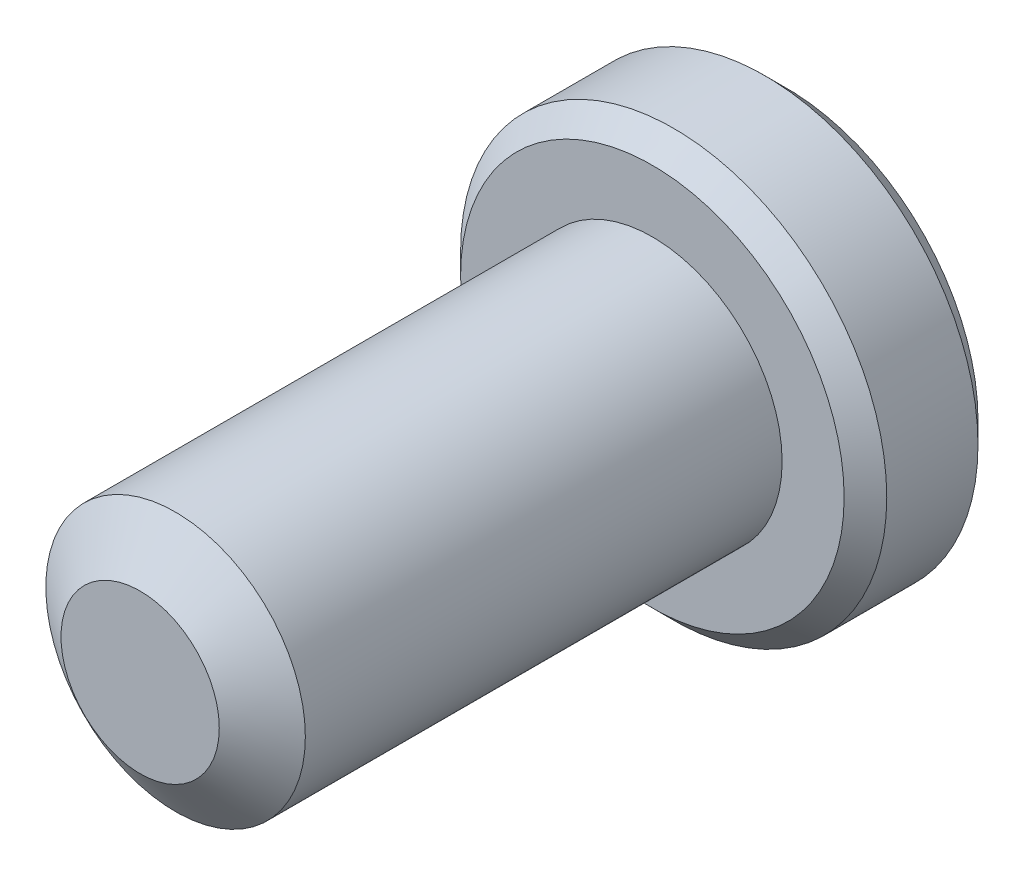
ISO-10303-21;
HEADER;
FILE_DESCRIPTION(('STEP AP214'),'2;1');
FILE_NAME('part.step','',(''),(''),'','','');
FILE_SCHEMA(('AUTOMOTIVE_DESIGN { 1 0 10303 214 1 1 1 1 }'));
ENDSEC;
DATA;
#1=APPLICATION_CONTEXT('core data for automotive mechanical design processes');
#2=APPLICATION_PROTOCOL_DEFINITION('international standard','automotive_design',2000,#1);
#3=PRODUCT_CONTEXT('',#1,'mechanical');
#4=PRODUCT('Part','Part','',(#3));
#5=PRODUCT_RELATED_PRODUCT_CATEGORY('part','',(#4));
#6=PRODUCT_DEFINITION_FORMATION('','',#4);
#7=PRODUCT_DEFINITION_CONTEXT('part definition',#1,'design');
#8=PRODUCT_DEFINITION('design','',#6,#7);
#9=PRODUCT_DEFINITION_SHAPE('','',#8);
#10=(LENGTH_UNIT() NAMED_UNIT(*) SI_UNIT(.MILLI.,.METRE.));
#11=(NAMED_UNIT(*) PLANE_ANGLE_UNIT() SI_UNIT($,.RADIAN.));
#12=(NAMED_UNIT(*) SI_UNIT($,.STERADIAN.) SOLID_ANGLE_UNIT());
#13=UNCERTAINTY_MEASURE_WITH_UNIT(LENGTH_MEASURE(1.E-05),#10,'distance_accuracy_value','');
#14=(GEOMETRIC_REPRESENTATION_CONTEXT(3) GLOBAL_UNCERTAINTY_ASSIGNED_CONTEXT((#13)) GLOBAL_UNIT_ASSIGNED_CONTEXT((#10,
#11,#12)) REPRESENTATION_CONTEXT('',''));
#15=CARTESIAN_POINT('',(0.,0.,0.));
#16=DIRECTION('',(0.,0.,1.));
#17=DIRECTION('',(1.,0.,0.));
#18=AXIS2_PLACEMENT_3D('',#15,#16,#17);
#19=CARTESIAN_POINT('',(0.,0.,-9.525));
#20=DIRECTION('',(0.,0.,1.));
#21=DIRECTION('',(1.,0.,0.));
#22=AXIS2_PLACEMENT_3D('',#19,#20,#21);
#23=CYLINDRICAL_SURFACE('',#22,2.413);
#24=CARTESIAN_POINT('',(0.,0.,-9.525));
#25=DIRECTION('',(0.,0.,-1.));
#26=DIRECTION('',(-1.,0.,0.));
#27=AXIS2_PLACEMENT_3D('',#24,#25,#26);
#28=CIRCLE('',#27,2.413);
#29=CARTESIAN_POINT('',(2.413,0.,-9.525));
#30=VERTEX_POINT('',#29);
#31=EDGE_CURVE('E219',#30,#30,#28,.F.);
#32=CARTESIAN_POINT('',(0.,0.,-0.659180743038973));
#33=DIRECTION('',(0.,0.,1.));
#34=DIRECTION('',(1.,0.,0.));
#35=AXIS2_PLACEMENT_3D('',#32,#33,#34);
#36=CIRCLE('',#35,2.413);
#37=CARTESIAN_POINT('',(2.413,0.,-0.659180743038973));
#38=VERTEX_POINT('',#37);
#39=EDGE_CURVE('E113',#38,#38,#36,.T.);
#40=CARTESIAN_POINT('',(2.413,0.,-9.525));
#41=CARTESIAN_POINT('',(2.413,0.,-9.43264771607332));
#42=CARTESIAN_POINT('',(2.413,0.,-9.34029543214664));
#43=CARTESIAN_POINT('',(2.413,0.,-9.15559086429329));
#44=CARTESIAN_POINT('',(2.413,0.,-9.06323858036661));
#45=CARTESIAN_POINT('',(2.413,0.,-8.87853401251326));
#46=CARTESIAN_POINT('',(2.413,0.,-8.78618172858658));
#47=CARTESIAN_POINT('',(2.413,0.,-8.60147716073322));
#48=CARTESIAN_POINT('',(2.413,0.,-8.50912487680655));
#49=CARTESIAN_POINT('',(2.413,0.,-8.32442030895319));
#50=CARTESIAN_POINT('',(2.413,0.,-8.23206802502652));
#51=CARTESIAN_POINT('',(2.413,0.,-8.04736345717316));
#52=CARTESIAN_POINT('',(2.413,0.,-7.95501117324648));
#53=CARTESIAN_POINT('',(2.413,0.,-7.77030660539313));
#54=CARTESIAN_POINT('',(2.413,0.,-7.67795432146645));
#55=CARTESIAN_POINT('',(2.413,0.,-7.4932497536131));
#56=CARTESIAN_POINT('',(2.413,0.,-7.40089746968642));
#57=CARTESIAN_POINT('',(2.413,0.,-7.21619290183307));
#58=CARTESIAN_POINT('',(2.413,0.,-7.12384061790639));
#59=CARTESIAN_POINT('',(2.413,0.,-6.93913605005303));
#60=CARTESIAN_POINT('',(2.413,0.,-6.84678376612636));
#61=CARTESIAN_POINT('',(2.413,0.,-6.662079198273));
#62=CARTESIAN_POINT('',(2.413,0.,-6.56972691434632));
#63=CARTESIAN_POINT('',(2.413,0.,-6.38502234649297));
#64=CARTESIAN_POINT('',(2.413,0.,-6.29267006256629));
#65=CARTESIAN_POINT('',(2.413,0.,-6.10796549471294));
#66=CARTESIAN_POINT('',(2.413,0.,-6.01561321078626));
#67=CARTESIAN_POINT('',(2.413,0.,-5.83090864293291));
#68=CARTESIAN_POINT('',(2.413,0.,-5.73855635900623));
#69=CARTESIAN_POINT('',(2.413,0.,-5.55385179115287));
#70=CARTESIAN_POINT('',(2.413,0.,-5.4614995072262));
#71=CARTESIAN_POINT('',(2.413,0.,-5.27679493937284));
#72=CARTESIAN_POINT('',(2.413,0.,-5.18444265544616));
#73=CARTESIAN_POINT('',(2.413,0.,-4.99973808759281));
#74=CARTESIAN_POINT('',(2.413,0.,-4.90738580366613));
#75=CARTESIAN_POINT('',(2.413,0.,-4.72268123581278));
#76=CARTESIAN_POINT('',(2.413,0.,-4.6303289518861));
#77=CARTESIAN_POINT('',(2.413,0.,-4.44562438403275));
#78=CARTESIAN_POINT('',(2.413,0.,-4.35327210010607));
#79=CARTESIAN_POINT('',(2.413,0.,-4.16856753225271));
#80=CARTESIAN_POINT('',(2.413,0.,-4.07621524832604));
#81=CARTESIAN_POINT('',(2.413,0.,-3.89151068047268));
#82=CARTESIAN_POINT('',(2.413,0.,-3.799158396546));
#83=CARTESIAN_POINT('',(2.413,0.,-3.61445382869265));
#84=CARTESIAN_POINT('',(2.413,0.,-3.52210154476597));
#85=CARTESIAN_POINT('',(2.413,0.,-3.33739697691262));
#86=CARTESIAN_POINT('',(2.413,0.,-3.24504469298594));
#87=CARTESIAN_POINT('',(2.413,0.,-3.06034012513258));
#88=CARTESIAN_POINT('',(2.413,0.,-2.96798784120591));
#89=CARTESIAN_POINT('',(2.413,0.,-2.78328327335255));
#90=CARTESIAN_POINT('',(2.413,0.,-2.69093098942588));
#91=CARTESIAN_POINT('',(2.413,0.,-2.50622642157252));
#92=CARTESIAN_POINT('',(2.413,0.,-2.41387413764584));
#93=CARTESIAN_POINT('',(2.413,0.,-2.22916956979249));
#94=CARTESIAN_POINT('',(2.413,0.,-2.13681728586581));
#95=CARTESIAN_POINT('',(2.413,0.,-1.95211271801246));
#96=CARTESIAN_POINT('',(2.413,0.,-1.85976043408578));
#97=CARTESIAN_POINT('',(2.413,0.,-1.67505586623242));
#98=CARTESIAN_POINT('',(2.413,0.,-1.58270358230575));
#99=CARTESIAN_POINT('',(2.413,0.,-1.39799901445239));
#100=CARTESIAN_POINT('',(2.413,0.,-1.30564673052571));
#101=CARTESIAN_POINT('',(2.413,0.,-1.12094216267236));
#102=CARTESIAN_POINT('',(2.413,0.,-1.02858987874568));
#103=CARTESIAN_POINT('',(2.413,0.,-0.843885310892327));
#104=CARTESIAN_POINT('',(2.413,0.,-0.75153302696565));
#105=CARTESIAN_POINT('',(2.413,0.,-0.659180743038973));
#106=B_SPLINE_CURVE_WITH_KNOTS('',3,(#40,#41,#42,#43,#44,#45,#46,#47,#48,#49,#50,#51,#52,#53,
#54,#55,#56,#57,#58,#59,#60,#61,#62,#63,#64,#65,#66,#67,#68,#69,#70,#71,#72,#73,#74,#75,#76,#77,
#78,#79,#80,#81,#82,#83,#84,#85,#86,#87,#88,#89,#90,#91,#92,#93,#94,#95,#96,#97,#98,#99,#100,
#101,#102,#103,#104,#105),.UNSPECIFIED.,.F.,.F.,(4,2,2,2,2,2,2,2,2,2,2,2,2,2,2,2,2,2,2,2,2,2,2,
2,2,2,2,2,2,2,2,2,4),(0.,0.277056851780031,0.554113703560063,0.831170555340096,1.10822740712013,
1.38528425890016,1.66234111068019,1.93939796246022,2.21645481424026,2.49351166602029,
2.77056851780032,3.04762536958035,3.32468222136038,3.60173907314042,3.87879592492045,
4.15585277670048,4.43290962848051,4.70996648026054,4.98702333204058,5.26408018382061,
5.54113703560064,5.81819388738067,6.09525073916071,6.37230759094074,6.64936444272077,
6.9264212945008,7.20347814628083,7.48053499806087,7.7575918498409,8.03464870162093,
8.31170555340096,8.58876240518099,8.86581925696103),.UNSPECIFIED.);
#107=EDGE_CURVE('BSEAM39',#30,#38,#106,.T.);
#108=ORIENTED_EDGE('',*,*,#31,.T.);
#109=ORIENTED_EDGE('',*,*,#39,.F.);
#110=ORIENTED_EDGE('',*,*,#107,.T.);
#111=ORIENTED_EDGE('',*,*,#107,.F.);
#112=EDGE_LOOP('',(#108,#110,#109,#111));
#113=FACE_BOUND('',#112,.T.);
#114=ADVANCED_FACE('F39',(#113),#23,.T.);
#115=CARTESIAN_POINT('',(0.,0.,0.));
#116=DIRECTION('',(0.,0.,-1.));
#117=DIRECTION('',(-1.,0.,0.));
#118=AXIS2_PLACEMENT_3D('',#115,#116,#117);
#119=CONICAL_SURFACE('',#118,1.4715923357461,0.959931088596884);
#120=ORIENTED_EDGE('',*,*,#39,.T.);
#121=EDGE_LOOP('',(#120));
#122=FACE_BOUND('',#121,.T.);
#123=CARTESIAN_POINT('',(0.,0.,0.));
#124=DIRECTION('',(0.,0.,1.));
#125=DIRECTION('',(1.,0.,0.));
#126=AXIS2_PLACEMENT_3D('',#123,#124,#125);
#127=CIRCLE('',#126,1.4715923357461);
#128=CARTESIAN_POINT('',(1.4715923357461,0.,0.));
#129=VERTEX_POINT('',#128);
#130=EDGE_CURVE('E217',#129,#129,#127,.T.);
#131=ORIENTED_EDGE('',*,*,#130,.F.);
#132=EDGE_LOOP('',(#131));
#133=FACE_BOUND('',#132,.T.);
#134=ADVANCED_FACE('F200',(#122,#133),#119,.T.);
#135=CARTESIAN_POINT('',(0.,0.,0.));
#136=DIRECTION('',(0.,0.,1.));
#137=DIRECTION('',(1.,0.,0.));
#138=AXIS2_PLACEMENT_3D('',#135,#136,#137);
#139=PLANE('',#138);
#140=ORIENTED_EDGE('',*,*,#130,.T.);
#141=EDGE_LOOP('',(#140));
#142=FACE_BOUND('',#141,.T.);
#143=ADVANCED_FACE('F197',(#142),#139,.T.);
#144=CARTESIAN_POINT('',(0.,0.,-12.0142));
#145=DIRECTION('',(0.,0.,1.));
#146=DIRECTION('',(1.,0.,0.));
#147=AXIS2_PLACEMENT_3D('',#144,#145,#146);
#148=CYLINDRICAL_SURFACE('',#147,3.9624);
#149=CARTESIAN_POINT('',(0.,0.,-11.61796));
#150=DIRECTION('',(0.,0.,-1.));
#151=DIRECTION('',(-1.,0.,0.));
#152=AXIS2_PLACEMENT_3D('',#149,#150,#151);
#153=CIRCLE('',#152,3.9624);
#154=CARTESIAN_POINT('',(3.9624,0.,-11.61796));
#155=VERTEX_POINT('',#154);
#156=EDGE_CURVE('E47',#155,#155,#153,.F.);
#157=ORIENTED_EDGE('',*,*,#156,.T.);
#158=EDGE_LOOP('',(#157));
#159=FACE_BOUND('',#158,.T.);
#160=CARTESIAN_POINT('',(0.,0.,-9.92124));
#161=DIRECTION('',(0.,0.,-1.));
#162=DIRECTION('',(-1.,0.,0.));
#163=AXIS2_PLACEMENT_3D('',#160,#161,#162);
#164=CIRCLE('',#163,3.9624);
#165=CARTESIAN_POINT('',(-3.9624,0.,-9.92124));
#166=VERTEX_POINT('',#165);
#167=EDGE_CURVE('E176',#166,#166,#164,.T.);
#168=ORIENTED_EDGE('',*,*,#167,.T.);
#169=EDGE_LOOP('',(#168));
#170=FACE_BOUND('',#169,.T.);
#171=ADVANCED_FACE('F181',(#159,#170),#148,.T.);
#172=CARTESIAN_POINT('',(0.,0.,-12.0142));
#173=DIRECTION('',(0.,0.,-1.));
#174=DIRECTION('',(-1.,0.,0.));
#175=AXIS2_PLACEMENT_3D('',#172,#173,#174);
#176=PLANE('',#175);
#177=CARTESIAN_POINT('',(0.,0.,-12.0142));
#178=DIRECTION('',(0.,0.,-1.));
#179=DIRECTION('',(-1.,0.,0.));
#180=AXIS2_PLACEMENT_3D('',#177,#178,#179);
#181=CIRCLE('',#180,3.56616);
#182=CARTESIAN_POINT('',(3.56616,0.,-12.0142));
#183=VERTEX_POINT('',#182);
#184=EDGE_CURVE('E112',#183,#183,#181,.T.);
#185=ORIENTED_EDGE('',*,*,#184,.T.);
#186=EDGE_LOOP('',(#185));
#187=FACE_BOUND('',#186,.T.);
#188=CARTESIAN_POINT('',(0.,0.,-12.0142));
#189=DIRECTION('',(0.,0.,-1.));
#190=DIRECTION('',(-1.,0.,0.));
#191=AXIS2_PLACEMENT_3D('',#188,#189,#190);
#192=CIRCLE('',#191,1.3748153285078);
#193=CARTESIAN_POINT('',(-1.190625,0.687407664253897,-12.0142));
#194=VERTEX_POINT('',#193);
#195=CARTESIAN_POINT('',(0.,1.3748153285078,-12.0142));
#196=VERTEX_POINT('',#195);
#197=EDGE_CURVE('E93',#194,#196,#192,.T.);
#198=ORIENTED_EDGE('',*,*,#197,.F.);
#199=CARTESIAN_POINT('',(-1.190625,-0.687407664253898,-12.0142));
#200=VERTEX_POINT('',#199);
#201=EDGE_CURVE('E53',#200,#194,#192,.T.);
#202=ORIENTED_EDGE('',*,*,#201,.F.);
#203=CARTESIAN_POINT('',(0.,-1.3748153285078,-12.0142));
#204=VERTEX_POINT('',#203);
#205=EDGE_CURVE('E278',#204,#200,#192,.T.);
#206=ORIENTED_EDGE('',*,*,#205,.F.);
#207=CARTESIAN_POINT('',(1.190625,-0.687407664253898,-12.0142));
#208=VERTEX_POINT('',#207);
#209=EDGE_CURVE('E60',#208,#204,#192,.T.);
#210=ORIENTED_EDGE('',*,*,#209,.F.);
#211=CARTESIAN_POINT('',(1.190625,0.687407664253899,-12.0142));
#212=VERTEX_POINT('',#211);
#213=EDGE_CURVE('E134',#212,#208,#192,.T.);
#214=ORIENTED_EDGE('',*,*,#213,.F.);
#215=EDGE_CURVE('E102',#196,#212,#192,.T.);
#216=ORIENTED_EDGE('',*,*,#215,.F.);
#217=EDGE_LOOP('',(#198,#202,#206,#210,#214,#216));
#218=FACE_BOUND('',#217,.T.);
#219=ADVANCED_FACE('F133',(#187,#218),#176,.T.);
#220=CARTESIAN_POINT('',(0.,0.,-9.525));
#221=DIRECTION('',(0.,0.,-1.));
#222=DIRECTION('',(-1.,0.,0.));
#223=AXIS2_PLACEMENT_3D('',#220,#221,#222);
#224=PLANE('',#223);
#225=CARTESIAN_POINT('',(0.,0.,-9.525));
#226=DIRECTION('',(0.,0.,-1.));
#227=DIRECTION('',(-1.,0.,0.));
#228=AXIS2_PLACEMENT_3D('',#225,#226,#227);
#229=CIRCLE('',#228,3.56616);
#230=CARTESIAN_POINT('',(-3.56616,0.,-9.525));
#231=VERTEX_POINT('',#230);
#232=EDGE_CURVE('E11',#231,#231,#229,.F.);
#233=ORIENTED_EDGE('',*,*,#232,.T.);
#234=EDGE_LOOP('',(#233));
#235=FACE_BOUND('',#234,.T.);
#236=ORIENTED_EDGE('',*,*,#31,.F.);
#237=EDGE_LOOP('',(#236));
#238=FACE_BOUND('',#237,.T.);
#239=ADVANCED_FACE('F190',(#235,#238),#224,.F.);
#240=CARTESIAN_POINT('',(0.,0.,-12.0142));
#241=DIRECTION('',(0.,0.,-1.));
#242=DIRECTION('',(-1.,0.,0.));
#243=AXIS2_PLACEMENT_3D('',#240,#241,#242);
#244=CONICAL_SURFACE('',#243,1.3748153285078,0.78539816339745);
#245=ORIENTED_EDGE('',*,*,#215,.T.);
#246=CARTESIAN_POINT('',(-0.000200000000000167,1.37493079856163,-12.0143154846));
#247=CARTESIAN_POINT('',(0.0407344195898563,1.35129730039231,-11.9906987642143));
#248=CARTESIAN_POINT('',(0.0823533883019738,1.32726857760297,-11.9684687817231));
#249=CARTESIAN_POINT('',(0.167219443673632,1.27827113768909,-11.9277656626274));
#250=CARTESIAN_POINT('',(0.21047460729096,1.25329775733078,-11.9093151826476));
#251=CARTESIAN_POINT('',(0.297696647457423,1.2029400889614,-11.8777088380043));
#252=CARTESIAN_POINT('',(0.341641294957924,1.17756863489755,-11.8644735042433));
#253=CARTESIAN_POINT('',(0.430498374163692,1.12626697629869,-11.8440814515754));
#254=CARTESIAN_POINT('',(0.475408088834753,1.10033834044413,-11.836909502896));
#255=CARTESIAN_POINT('',(0.552804127656977,1.0556537165959,-11.8304385386489));
#256=CARTESIAN_POINT('',(0.585190412515645,1.0369554863147,-11.8294803201468));
#257=CARTESIAN_POINT('',(0.649906073317768,0.99959188212981,-11.8310926490721));
#258=CARTESIAN_POINT('',(0.682235435127271,0.980926516386365,-11.8336639751796));
#259=CARTESIAN_POINT('',(0.746582156071483,0.943775919727754,-11.8421867539936));
#260=CARTESIAN_POINT('',(0.778599196336766,0.925290872911938,-11.8481413547526));
#261=CARTESIAN_POINT('',(0.842098763396456,0.888629380776602,-11.8631099640712));
#262=CARTESIAN_POINT('',(0.873581054644163,0.870453071450032,-11.8721252859121));
#263=CARTESIAN_POINT('',(0.954214838572126,0.823899134593445,-11.898882295838));
#264=CARTESIAN_POINT('',(1.00285783526766,0.795815087357089,-11.918636814436));
#265=CARTESIAN_POINT('',(1.09823941635212,0.740746505842243,-11.9631367689577));
#266=CARTESIAN_POINT('',(1.14498361758716,0.713758728676141,-11.9878659647162));
#267=CARTESIAN_POINT('',(1.190825,0.68729219420006,-12.0143154846));
#268=B_SPLINE_CURVE_WITH_KNOTS('',3,(#246,#247,#248,#249,#250,#251,#252,#253,#254,#255,#256,
#257,#258,#259,#260,#261,#262,#263,#264,#265,#266,#267),.UNSPECIFIED.,.F.,.F.,(4,2,2,2,2,2,2,2,
2,2,4),(0.,0.158625672934121,0.31817607984327,0.475191357500654,0.631811068630747,
0.743878551794717,0.855970763007027,0.96816744442324,1.08041232768376,1.25873351645467,
1.43648174479847),.UNSPECIFIED.);
#269=EDGE_CURVE('E107',#196,#212,#268,.T.);
#270=ORIENTED_EDGE('',*,*,#269,.F.);
#271=EDGE_LOOP('',(#245,#270));
#272=FACE_BOUND('',#271,.T.);
#273=ADVANCED_FACE('F108',(#272),#244,.F.);
#274=ORIENTED_EDGE('',*,*,#213,.T.);
#275=CARTESIAN_POINT('',(1.190625,-1.37097145294693,-12.4551904472899));
#276=CARTESIAN_POINT('',(1.190625,-1.3375892063789,-12.4299899888078));
#277=CARTESIAN_POINT('',(1.190625,-1.30402095496658,-12.4050366202375));
#278=CARTESIAN_POINT('',(1.190625,-1.23643692297761,-12.3557260871772));
#279=CARTESIAN_POINT('',(1.190625,-1.20242103219112,-12.3313690738994));
#280=CARTESIAN_POINT('',(1.190625,-1.09909081482554,-12.2589982089892));
#281=CARTESIAN_POINT('',(1.190625,-1.02900143506767,-12.2120726225956));
#282=CARTESIAN_POINT('',(1.190625,-0.882026737424229,-12.1199521033256));
#283=CARTESIAN_POINT('',(1.190625,-0.804981866019981,-12.0750088372421));
#284=CARTESIAN_POINT('',(1.190625,-0.647043893307964,-11.9927980245069));
#285=CARTESIAN_POINT('',(1.190625,-0.56616494370292,-11.9555046017321));
#286=CARTESIAN_POINT('',(1.190625,-0.444764933868856,-11.9098795555631));
#287=CARTESIAN_POINT('',(1.190625,-0.406041211486713,-11.8967848390215));
#288=CARTESIAN_POINT('',(1.190625,-0.327658904711933,-11.8737042758966));
#289=CARTESIAN_POINT('',(1.190625,-0.288000256118252,-11.863718643486));
#290=CARTESIAN_POINT('',(1.190625,-0.208647693212097,-11.8475412290653));
#291=CARTESIAN_POINT('',(1.190625,-0.168967240621962,-11.841284445849));
#292=CARTESIAN_POINT('',(1.190625,-0.0891819742965335,-11.8326868884185));
#293=CARTESIAN_POINT('',(1.190625,-0.0490772347013127,-11.8303454410499));
#294=CARTESIAN_POINT('',(1.190625,0.0297075773931762,-11.8297522440677));
#295=CARTESIAN_POINT('',(1.190625,0.0683866068288083,-11.8313553537961));
#296=CARTESIAN_POINT('',(1.190625,0.14541687663315,-11.8382430277445));
#297=CARTESIAN_POINT('',(1.190625,0.183768052740678,-11.8435282976685));
#298=CARTESIAN_POINT('',(1.190625,0.260508634904943,-11.8575814122329));
#299=CARTESIAN_POINT('',(1.190625,0.298887052039132,-11.8664083626058));
#300=CARTESIAN_POINT('',(1.190625,0.374805334250663,-11.8870757099806));
#301=CARTESIAN_POINT('',(1.190625,0.412345269207093,-11.8989158548359));
#302=CARTESIAN_POINT('',(1.190625,0.530535580908838,-11.9406473336672));
#303=CARTESIAN_POINT('',(1.190625,0.609503725744446,-11.9752913969143));
#304=CARTESIAN_POINT('',(1.190625,0.763730269113465,-12.0523182519749));
#305=CARTESIAN_POINT('',(1.190625,0.838974064674605,-12.0947288466687));
#306=CARTESIAN_POINT('',(1.190625,0.982775796189617,-12.182225645025));
#307=CARTESIAN_POINT('',(1.190625,1.05148016607044,-12.2270741620552));
#308=CARTESIAN_POINT('',(1.190625,1.15270222256253,-12.2964053299226));
#309=CARTESIAN_POINT('',(1.190625,1.18600604145834,-12.3197601763372));
#310=CARTESIAN_POINT('',(1.190625,1.25215860362231,-12.3670875690193));
#311=CARTESIAN_POINT('',(1.190625,1.28500746868278,-12.3910599448583));
#312=CARTESIAN_POINT('',(1.190625,1.31766689427973,-12.4152883667713));
#313=B_SPLINE_CURVE_WITH_KNOTS('',3,(#275,#276,#277,#278,#279,#280,#281,#282,#283,#284,#285,
#286,#287,#288,#289,#290,#291,#292,#293,#294,#295,#296,#297,#298,#299,#300,#301,#302,#303,#304,
#305,#306,#307,#308,#309,#310,#311,#312),.UNSPECIFIED.,.F.,.F.,(4,2,2,2,2,2,2,2,2,2,2,2,2,2,2,2,
2,2,4),(0.,0.125475644763329,0.250982782413965,0.503912518769173,0.771279184643224,
1.03772598255657,1.16025581644629,1.28279408906665,1.40312855503246,1.5234423300503,
1.63939577664877,1.75537145240477,1.87336894094838,1.99135655861152,2.24929724983449,
2.50818004711563,2.75419821472196,2.87622362118596,2.99821570388961),.UNSPECIFIED.);
#314=EDGE_CURVE('E101',#212,#208,#313,.F.);
#315=ORIENTED_EDGE('',*,*,#314,.F.);
#316=EDGE_LOOP('',(#274,#315));
#317=FACE_BOUND('',#316,.T.);
#318=ADVANCED_FACE('F284',(#317),#244,.F.);
#319=ORIENTED_EDGE('',*,*,#209,.T.);
#320=CARTESIAN_POINT('',(1.190825,-0.687292194200061,-12.0143154846));
#321=CARTESIAN_POINT('',(1.14989058041014,-0.710925692369386,-11.9906987642143));
#322=CARTESIAN_POINT('',(1.10827161169803,-0.734954415158721,-11.9684687817231));
#323=CARTESIAN_POINT('',(1.02340555632637,-0.78395185507261,-11.9277656626274));
#324=CARTESIAN_POINT('',(0.98015039270904,-0.808925235430915,-11.9093151826476));
#325=CARTESIAN_POINT('',(0.892928352542577,-0.859282903800291,-11.8777088380043));
#326=CARTESIAN_POINT('',(0.848983705042076,-0.884654357864149,-11.8644735042433));
#327=CARTESIAN_POINT('',(0.760126625836307,-0.935956016463003,-11.8440814515754));
#328=CARTESIAN_POINT('',(0.715216911165246,-0.961884652317569,-11.836909502896));
#329=CARTESIAN_POINT('',(0.637820872343022,-1.00656927616579,-11.8304385386489));
#330=CARTESIAN_POINT('',(0.605434587484354,-1.025267506447,-11.8294803201468));
#331=CARTESIAN_POINT('',(0.540718926682231,-1.06263111063189,-11.8310926490721));
#332=CARTESIAN_POINT('',(0.508389564872728,-1.08129647637533,-11.8336639751796));
#333=CARTESIAN_POINT('',(0.444042843928516,-1.11844707303394,-11.8421867539936));
#334=CARTESIAN_POINT('',(0.412025803663233,-1.13693211984976,-11.8481413547526));
#335=CARTESIAN_POINT('',(0.348526236603544,-1.17359361198509,-11.8631099640712));
#336=CARTESIAN_POINT('',(0.317043945355836,-1.19176992131166,-11.8721252859121));
#337=CARTESIAN_POINT('',(0.236410161427874,-1.23832385816825,-11.898882295838));
#338=CARTESIAN_POINT('',(0.187767164732343,-1.26640790540461,-11.918636814436));
#339=CARTESIAN_POINT('',(0.0923855836478816,-1.32147648691945,-11.9631367689577));
#340=CARTESIAN_POINT('',(0.0456413824128449,-1.34846426408555,-11.9878659647162));
#341=CARTESIAN_POINT('',(-0.000199999999999776,-1.37493079856163,-12.0143154846));
#342=B_SPLINE_CURVE_WITH_KNOTS('',3,(#320,#321,#322,#323,#324,#325,#326,#327,#328,#329,#330,
#331,#332,#333,#334,#335,#336,#337,#338,#339,#340,#341),.UNSPECIFIED.,.F.,.F.,(4,2,2,2,2,2,2,2,
2,2,4),(0.,0.158625672934121,0.318176079843271,0.475191357500655,0.631811068630748,
0.743878551794717,0.855970763007028,0.968167444423241,1.08041232768376,1.25873351645467,
1.43648174479847),.UNSPECIFIED.);
#343=EDGE_CURVE('E144',#208,#204,#342,.T.);
#344=ORIENTED_EDGE('',*,*,#343,.F.);
#345=EDGE_LOOP('',(#319,#344));
#346=FACE_BOUND('',#345,.T.);
#347=ADVANCED_FACE('F281',(#346),#244,.F.);
#348=ORIENTED_EDGE('',*,*,#205,.T.);
#349=CARTESIAN_POINT('',(0.000200000000000495,-1.37493079856163,-12.0143154846));
#350=CARTESIAN_POINT('',(-0.0407344195898561,-1.35129730039231,-11.9906987642143));
#351=CARTESIAN_POINT('',(-0.0823533883019738,-1.32726857760297,-11.9684687817231));
#352=CARTESIAN_POINT('',(-0.167219443673632,-1.27827113768909,-11.9277656626274));
#353=CARTESIAN_POINT('',(-0.21047460729096,-1.25329775733078,-11.9093151826476));
#354=CARTESIAN_POINT('',(-0.297696647457424,-1.2029400889614,-11.8777088380043));
#355=CARTESIAN_POINT('',(-0.341641294957924,-1.17756863489755,-11.8644735042433));
#356=CARTESIAN_POINT('',(-0.430498374163693,-1.12626697629869,-11.8440814515754));
#357=CARTESIAN_POINT('',(-0.475408088834755,-1.10033834044413,-11.836909502896));
#358=CARTESIAN_POINT('',(-0.552804127656978,-1.0556537165959,-11.8304385386489));
#359=CARTESIAN_POINT('',(-0.585190412515646,-1.0369554863147,-11.8294803201468));
#360=CARTESIAN_POINT('',(-0.649906073317769,-0.99959188212981,-11.8310926490721));
#361=CARTESIAN_POINT('',(-0.682235435127272,-0.980926516386364,-11.8336639751796));
#362=CARTESIAN_POINT('',(-0.746582156071484,-0.943775919727754,-11.8421867539936));
#363=CARTESIAN_POINT('',(-0.778599196336767,-0.925290872911938,-11.8481413547526));
#364=CARTESIAN_POINT('',(-0.842098763396457,-0.888629380776601,-11.8631099640712));
#365=CARTESIAN_POINT('',(-0.873581054644164,-0.870453071450031,-11.8721252859121));
#366=CARTESIAN_POINT('',(-0.954214838572126,-0.823899134593444,-11.898882295838));
#367=CARTESIAN_POINT('',(-1.00285783526766,-0.795815087357089,-11.918636814436));
#368=CARTESIAN_POINT('',(-1.09823941635212,-0.740746505842243,-11.9631367689577));
#369=CARTESIAN_POINT('',(-1.14498361758716,-0.713758728676141,-11.9878659647162));
#370=CARTESIAN_POINT('',(-1.190825,-0.68729219420006,-12.0143154846));
#371=B_SPLINE_CURVE_WITH_KNOTS('',3,(#349,#350,#351,#352,#353,#354,#355,#356,#357,#358,#359,
#360,#361,#362,#363,#364,#365,#366,#367,#368,#369,#370),.UNSPECIFIED.,.F.,.F.,(4,2,2,2,2,2,2,2,
2,2,4),(0.,0.158625672934121,0.318176079843271,0.475191357500655,0.631811068630749,
0.743878551794718,0.855970763007029,0.968167444423242,1.08041232768377,1.25873351645467,
1.43648174479847),.UNSPECIFIED.);
#372=EDGE_CURVE('E255',#204,#200,#371,.T.);
#373=ORIENTED_EDGE('',*,*,#372,.F.);
#374=EDGE_LOOP('',(#348,#373));
#375=FACE_BOUND('',#374,.T.);
#376=ADVANCED_FACE('F280',(#375),#244,.F.);
#377=ORIENTED_EDGE('',*,*,#201,.T.);
#378=CARTESIAN_POINT('',(-1.190625,-1.3709714531464,-12.4551904474405));
#379=CARTESIAN_POINT('',(-1.190625,-1.33758920657277,-12.4299899889526));
#380=CARTESIAN_POINT('',(-1.190625,-1.30402095515484,-12.4050366203765));
#381=CARTESIAN_POINT('',(-1.190625,-1.23643692315458,-12.3557260873047));
#382=CARTESIAN_POINT('',(-1.190625,-1.20242103236242,-12.3313690740211));
#383=CARTESIAN_POINT('',(-1.190625,-1.09909081497949,-12.2589982090935));
#384=CARTESIAN_POINT('',(-1.190625,-1.02900143520981,-12.2120726226883));
#385=CARTESIAN_POINT('',(-1.190625,-0.88202673754063,-12.1199521033947));
#386=CARTESIAN_POINT('',(-1.190625,-0.804981866122374,-12.075008837299));
#387=CARTESIAN_POINT('',(-1.190625,-0.647043893381154,-11.9927980245414));
#388=CARTESIAN_POINT('',(-1.190625,-0.566164943760923,-11.9555046017562));
#389=CARTESIAN_POINT('',(-1.190625,-0.444764933915431,-11.9098795555795));
#390=CARTESIAN_POINT('',(-1.190625,-0.406041211538074,-11.8967848390382));
#391=CARTESIAN_POINT('',(-1.190625,-0.327658904773021,-11.873704275913));
#392=CARTESIAN_POINT('',(-1.190625,-0.288000256184282,-11.8637186435017));
#393=CARTESIAN_POINT('',(-1.190625,-0.208647693287848,-11.8475412290785));
#394=CARTESIAN_POINT('',(-1.190625,-0.16896724070249,-11.8412844458605));
#395=CARTESIAN_POINT('',(-1.190625,-0.0891819743864545,-11.8326868884254));
#396=CARTESIAN_POINT('',(-1.190625,-0.0490772347958503,-11.8303454410539));
#397=CARTESIAN_POINT('',(-1.190625,0.0297075772901233,-11.8297522440652));
#398=CARTESIAN_POINT('',(-1.190625,0.068386606721845,-11.83135535379));
#399=CARTESIAN_POINT('',(-1.190625,0.145416876518752,-11.8382430277307));
#400=CARTESIAN_POINT('',(-1.190625,0.183768052622755,-11.8435282976506));
#401=CARTESIAN_POINT('',(-1.190625,0.260508634780066,-11.8575814122063));
#402=CARTESIAN_POINT('',(-1.190625,0.298887051910834,-11.8664083625746));
#403=CARTESIAN_POINT('',(-1.190625,0.374805334115855,-11.8870757099402));
#404=CARTESIAN_POINT('',(-1.190625,0.412345269069195,-11.8989158547908));
#405=CARTESIAN_POINT('',(-1.190625,0.530535580740913,-11.9406473336));
#406=CARTESIAN_POINT('',(-1.190625,0.609503725551088,-11.9752913968269));
#407=CARTESIAN_POINT('',(-1.190625,0.763730268871195,-12.0523182518447));
#408=CARTESIAN_POINT('',(-1.190625,0.838974064408866,-12.0947288465159));
#409=CARTESIAN_POINT('',(-1.190625,0.982775795881686,-12.1822256448291));
#410=CARTESIAN_POINT('',(-1.190625,1.05148016574364,-12.227074161839));
#411=CARTESIAN_POINT('',(-1.190625,1.15270222220782,-12.2964053296759));
#412=CARTESIAN_POINT('',(-1.190625,1.18600604109445,-12.3197601760804));
#413=CARTESIAN_POINT('',(-1.190625,1.25215860324015,-12.3670875687424));
#414=CARTESIAN_POINT('',(-1.190625,1.28500746829151,-12.3910599445713));
#415=CARTESIAN_POINT('',(-1.190625,1.31766689387937,-12.4152883664742));
#416=B_SPLINE_CURVE_WITH_KNOTS('',3,(#378,#379,#380,#381,#382,#383,#384,#385,#386,#387,#388,
#389,#390,#391,#392,#393,#394,#395,#396,#397,#398,#399,#400,#401,#402,#403,#404,#405,#406,#407,
#408,#409,#410,#411,#412,#413,#414,#415),.UNSPECIFIED.,.F.,.F.,(4,2,2,2,2,2,2,2,2,2,2,2,2,2,2,2,
2,2,4),(0.,0.125475644787213,0.250982782461739,0.503912518865619,0.771279184794252,
1.03772598276166,1.16025581663754,1.28279408924409,1.40312855519665,1.52344233020124,
1.63939577678759,1.75537145253145,1.87336894106198,1.99135655871207,2.24929724984114,
2.50818004702776,2.75419821455323,2.87622362097735,2.99821570364111),.UNSPECIFIED.);
#417=EDGE_CURVE('E123',#200,#194,#416,.T.);
#418=ORIENTED_EDGE('',*,*,#417,.F.);
#419=EDGE_LOOP('',(#377,#418));
#420=FACE_BOUND('',#419,.T.);
#421=ADVANCED_FACE('F293',(#420),#244,.F.);
#422=ORIENTED_EDGE('',*,*,#197,.T.);
#423=CARTESIAN_POINT('',(-1.190825,0.68729219420006,-12.0143154846));
#424=CARTESIAN_POINT('',(-1.14989058041014,0.710925692369385,-11.9906987642143));
#425=CARTESIAN_POINT('',(-1.10827161169803,0.734954415158721,-11.9684687817231));
#426=CARTESIAN_POINT('',(-1.02340555632637,0.783951855072609,-11.9277656626274));
#427=CARTESIAN_POINT('',(-0.98015039270904,0.808925235430915,-11.9093151826476));
#428=CARTESIAN_POINT('',(-0.892928352542577,0.85928290380029,-11.8777088380043));
#429=CARTESIAN_POINT('',(-0.848983705042076,0.884654357864148,-11.8644735042433));
#430=CARTESIAN_POINT('',(-0.760126625836307,0.935956016463002,-11.8440814515754));
#431=CARTESIAN_POINT('',(-0.715216911165246,0.961884652317569,-11.836909502896));
#432=CARTESIAN_POINT('',(-0.637820872343023,1.00656927616579,-11.8304385386489));
#433=CARTESIAN_POINT('',(-0.605434587484354,1.02526750644699,-11.8294803201468));
#434=CARTESIAN_POINT('',(-0.540718926682231,1.06263111063188,-11.8310926490721));
#435=CARTESIAN_POINT('',(-0.508389564872728,1.08129647637533,-11.8336639751796));
#436=CARTESIAN_POINT('',(-0.444042843928516,1.11844707303394,-11.8421867539936));
#437=CARTESIAN_POINT('',(-0.412025803663233,1.13693211984976,-11.8481413547526));
#438=CARTESIAN_POINT('',(-0.348526236603544,1.17359361198509,-11.8631099640712));
#439=CARTESIAN_POINT('',(-0.317043945355837,1.19176992131166,-11.8721252859121));
#440=CARTESIAN_POINT('',(-0.236410161427874,1.23832385816825,-11.898882295838));
#441=CARTESIAN_POINT('',(-0.187767164732342,1.26640790540461,-11.918636814436));
#442=CARTESIAN_POINT('',(-0.092385583647881,1.32147648691945,-11.9631367689577));
#443=CARTESIAN_POINT('',(-0.0456413824128442,1.34846426408555,-11.9878659647162));
#444=CARTESIAN_POINT('',(0.000200000000000743,1.37493079856163,-12.0143154846));
#445=B_SPLINE_CURVE_WITH_KNOTS('',3,(#423,#424,#425,#426,#427,#428,#429,#430,#431,#432,#433,
#434,#435,#436,#437,#438,#439,#440,#441,#442,#443,#444),.UNSPECIFIED.,.F.,.F.,(4,2,2,2,2,2,2,2,
2,2,4),(0.,0.158625672934121,0.318176079843271,0.475191357500655,0.631811068630748,
0.743878551794718,0.855970763007029,0.968167444423241,1.08041232768377,1.25873351645467,
1.43648174479847),.UNSPECIFIED.);
#446=EDGE_CURVE('E97',#194,#196,#445,.T.);
#447=ORIENTED_EDGE('',*,*,#446,.F.);
#448=EDGE_LOOP('',(#422,#447));
#449=FACE_BOUND('',#448,.T.);
#450=ADVANCED_FACE('F95',(#449),#244,.F.);
#451=CARTESIAN_POINT('',(1.190625,2.06222299276169,-10.2282625));
#452=DIRECTION('',(0.,0.,-1.));
#453=DIRECTION('',(-1.,0.,0.));
#454=AXIS2_PLACEMENT_3D('',#451,#452,#453);
#455=PLANE('',#454);
#456=DIRECTION('',(0.866025403784439,0.5,0.));
#457=VECTOR('',#456,1.);
#458=CARTESIAN_POINT('',(-1.190625,0.687407664253898,-10.2282625));
#459=LINE('',#458,#457);
#460=CARTESIAN_POINT('',(-1.190625,0.687407664253898,-10.2282625));
#461=VERTEX_POINT('',#460);
#462=CARTESIAN_POINT('',(0.,1.3748153285078,-10.2282625));
#463=VERTEX_POINT('',#462);
#464=EDGE_CURVE('E122',#461,#463,#459,.T.);
#465=ORIENTED_EDGE('',*,*,#464,.T.);
#466=DIRECTION('',(0.866025403784439,-0.5,0.));
#467=VECTOR('',#466,1.);
#468=CARTESIAN_POINT('',(0.,1.3748153285078,-10.2282625));
#469=LINE('',#468,#467);
#470=CARTESIAN_POINT('',(1.190625,0.687407664253898,-10.2282625));
#471=VERTEX_POINT('',#470);
#472=EDGE_CURVE('E127',#463,#471,#469,.T.);
#473=ORIENTED_EDGE('',*,*,#472,.T.);
#474=DIRECTION('',(0.,-1.,0.));
#475=VECTOR('',#474,1.);
#476=CARTESIAN_POINT('',(1.190625,0.687407664253898,-10.2282625));
#477=LINE('',#476,#475);
#478=CARTESIAN_POINT('',(1.190625,-0.687407664253899,-10.2282625));
#479=VERTEX_POINT('',#478);
#480=EDGE_CURVE('E241',#471,#479,#477,.T.);
#481=ORIENTED_EDGE('',*,*,#480,.T.);
#482=DIRECTION('',(-0.866025403784439,-0.5,0.));
#483=VECTOR('',#482,1.);
#484=CARTESIAN_POINT('',(1.190625,-0.687407664253899,-10.2282625));
#485=LINE('',#484,#483);
#486=CARTESIAN_POINT('',(0.,-1.3748153285078,-10.2282625));
#487=VERTEX_POINT('',#486);
#488=EDGE_CURVE('E238',#479,#487,#485,.T.);
#489=ORIENTED_EDGE('',*,*,#488,.T.);
#490=DIRECTION('',(-0.866025403784439,0.5,0.));
#491=VECTOR('',#490,1.);
#492=CARTESIAN_POINT('',(0.,-1.3748153285078,-10.2282625));
#493=LINE('',#492,#491);
#494=CARTESIAN_POINT('',(-1.190625,-0.687407664253898,-10.2282625));
#495=VERTEX_POINT('',#494);
#496=EDGE_CURVE('E235',#487,#495,#493,.T.);
#497=ORIENTED_EDGE('',*,*,#496,.T.);
#498=DIRECTION('',(0.,1.,0.));
#499=VECTOR('',#498,1.);
#500=CARTESIAN_POINT('',(-1.190625,-0.687407664253898,-10.2282625));
#501=LINE('',#500,#499);
#502=EDGE_CURVE('E130',#495,#461,#501,.T.);
#503=ORIENTED_EDGE('',*,*,#502,.T.);
#504=EDGE_LOOP('',(#465,#473,#481,#489,#497,#503));
#505=FACE_BOUND('',#504,.T.);
#506=ADVANCED_FACE('F164',(#505),#455,.T.);
#507=CARTESIAN_POINT('',(0.,1.3748153285078,-10.2282625));
#508=DIRECTION('',(0.5,0.866025403784439,0.));
#509=DIRECTION('',(-0.866025403784439,0.5,0.));
#510=AXIS2_PLACEMENT_3D('',#507,#508,#509);
#511=PLANE('',#510);
#512=DIRECTION('',(0.,0.,-1.));
#513=VECTOR('',#512,1.);
#514=CARTESIAN_POINT('',(0.,1.3748153285078,-10.2282625));
#515=LINE('',#514,#513);
#516=EDGE_CURVE('E119',#463,#196,#515,.T.);
#517=ORIENTED_EDGE('',*,*,#516,.T.);
#518=ORIENTED_EDGE('',*,*,#269,.T.);
#519=DIRECTION('',(0.,0.,-1.));
#520=VECTOR('',#519,1.);
#521=CARTESIAN_POINT('',(1.190625,0.687407664253898,-10.2282625));
#522=LINE('',#521,#520);
#523=EDGE_CURVE('E129',#471,#212,#522,.T.);
#524=ORIENTED_EDGE('',*,*,#523,.F.);
#525=ORIENTED_EDGE('',*,*,#472,.F.);
#526=EDGE_LOOP('',(#517,#518,#524,#525));
#527=FACE_BOUND('',#526,.T.);
#528=ADVANCED_FACE('F125',(#527),#511,.F.);
#529=CARTESIAN_POINT('',(1.190625,0.687407664253898,-10.2282625));
#530=DIRECTION('',(1.,0.,0.));
#531=DIRECTION('',(0.,1.,0.));
#532=AXIS2_PLACEMENT_3D('',#529,#530,#531);
#533=PLANE('',#532);
#534=ORIENTED_EDGE('',*,*,#523,.T.);
#535=ORIENTED_EDGE('',*,*,#314,.T.);
#536=DIRECTION('',(0.,0.,-1.));
#537=VECTOR('',#536,1.);
#538=CARTESIAN_POINT('',(1.190625,-0.687407664253899,-10.2282625));
#539=LINE('',#538,#537);
#540=EDGE_CURVE('E224',#479,#208,#539,.T.);
#541=ORIENTED_EDGE('',*,*,#540,.F.);
#542=ORIENTED_EDGE('',*,*,#480,.F.);
#543=EDGE_LOOP('',(#534,#535,#541,#542));
#544=FACE_BOUND('',#543,.T.);
#545=ADVANCED_FACE('F153',(#544),#533,.F.);
#546=CARTESIAN_POINT('',(1.190625,-0.687407664253899,-10.2282625));
#547=DIRECTION('',(0.5,-0.866025403784439,0.));
#548=DIRECTION('',(0.866025403784439,0.5,0.));
#549=AXIS2_PLACEMENT_3D('',#546,#547,#548);
#550=PLANE('',#549);
#551=ORIENTED_EDGE('',*,*,#540,.T.);
#552=ORIENTED_EDGE('',*,*,#343,.T.);
#553=DIRECTION('',(0.,0.,-1.));
#554=VECTOR('',#553,1.);
#555=CARTESIAN_POINT('',(0.,-1.3748153285078,-10.2282625));
#556=LINE('',#555,#554);
#557=EDGE_CURVE('E227',#487,#204,#556,.T.);
#558=ORIENTED_EDGE('',*,*,#557,.F.);
#559=ORIENTED_EDGE('',*,*,#488,.F.);
#560=EDGE_LOOP('',(#551,#552,#558,#559));
#561=FACE_BOUND('',#560,.T.);
#562=ADVANCED_FACE('F157',(#561),#550,.F.);
#563=CARTESIAN_POINT('',(0.,-1.3748153285078,-10.2282625));
#564=DIRECTION('',(-0.5,-0.866025403784439,0.));
#565=DIRECTION('',(0.866025403784439,-0.5,0.));
#566=AXIS2_PLACEMENT_3D('',#563,#564,#565);
#567=PLANE('',#566);
#568=ORIENTED_EDGE('',*,*,#557,.T.);
#569=ORIENTED_EDGE('',*,*,#372,.T.);
#570=DIRECTION('',(0.,0.,-1.));
#571=VECTOR('',#570,1.);
#572=CARTESIAN_POINT('',(-1.190625,-0.687407664253898,-10.2282625));
#573=LINE('',#572,#571);
#574=EDGE_CURVE('E230',#495,#200,#573,.T.);
#575=ORIENTED_EDGE('',*,*,#574,.F.);
#576=ORIENTED_EDGE('',*,*,#496,.F.);
#577=EDGE_LOOP('',(#568,#569,#575,#576));
#578=FACE_BOUND('',#577,.T.);
#579=ADVANCED_FACE('F263',(#578),#567,.F.);
#580=CARTESIAN_POINT('',(-1.190625,-0.687407664253898,-10.2282625));
#581=DIRECTION('',(-1.,0.,0.));
#582=DIRECTION('',(0.,-1.,0.));
#583=AXIS2_PLACEMENT_3D('',#580,#581,#582);
#584=PLANE('',#583);
#585=ORIENTED_EDGE('',*,*,#574,.T.);
#586=ORIENTED_EDGE('',*,*,#417,.T.);
#587=DIRECTION('',(0.,0.,-1.));
#588=VECTOR('',#587,1.);
#589=CARTESIAN_POINT('',(-1.190625,0.687407664253898,-10.2282625));
#590=LINE('',#589,#588);
#591=EDGE_CURVE('E121',#461,#194,#590,.T.);
#592=ORIENTED_EDGE('',*,*,#591,.F.);
#593=ORIENTED_EDGE('',*,*,#502,.F.);
#594=EDGE_LOOP('',(#585,#586,#592,#593));
#595=FACE_BOUND('',#594,.T.);
#596=ADVANCED_FACE('F260',(#595),#584,.F.);
#597=CARTESIAN_POINT('',(-1.190625,0.687407664253898,-10.2282625));
#598=DIRECTION('',(-0.5,0.866025403784439,0.));
#599=DIRECTION('',(-0.866025403784439,-0.5,0.));
#600=AXIS2_PLACEMENT_3D('',#597,#598,#599);
#601=PLANE('',#600);
#602=ORIENTED_EDGE('',*,*,#591,.T.);
#603=ORIENTED_EDGE('',*,*,#446,.T.);
#604=ORIENTED_EDGE('',*,*,#516,.F.);
#605=ORIENTED_EDGE('',*,*,#464,.F.);
#606=EDGE_LOOP('',(#602,#603,#604,#605));
#607=FACE_BOUND('',#606,.T.);
#608=ADVANCED_FACE('F117',(#607),#601,.F.);
#609=CARTESIAN_POINT('',(0.,0.,-12.0142));
#610=DIRECTION('',(0.,0.,1.));
#611=DIRECTION('',(1.,0.,0.));
#612=AXIS2_PLACEMENT_3D('',#609,#610,#611);
#613=CONICAL_SURFACE('',#612,3.56616,0.785398163397446);
#614=CARTESIAN_POINT('',(3.9624,0.,-11.61796));
#615=CARTESIAN_POINT('',(3.9582725,0.,-11.6220875));
#616=CARTESIAN_POINT('',(3.954145,0.,-11.626215));
#617=CARTESIAN_POINT('',(3.94589,0.,-11.63447));
#618=CARTESIAN_POINT('',(3.9417625,0.,-11.6385975));
#619=CARTESIAN_POINT('',(3.9335075,0.,-11.6468525));
#620=CARTESIAN_POINT('',(3.92938,0.,-11.65098));
#621=CARTESIAN_POINT('',(3.921125,0.,-11.659235));
#622=CARTESIAN_POINT('',(3.9169975,0.,-11.6633625));
#623=CARTESIAN_POINT('',(3.9087425,0.,-11.6716175));
#624=CARTESIAN_POINT('',(3.904615,0.,-11.675745));
#625=CARTESIAN_POINT('',(3.89636,0.,-11.684));
#626=CARTESIAN_POINT('',(3.8922325,0.,-11.6881275));
#627=CARTESIAN_POINT('',(3.8839775,0.,-11.6963825));
#628=CARTESIAN_POINT('',(3.87985,0.,-11.70051));
#629=CARTESIAN_POINT('',(3.871595,0.,-11.708765));
#630=CARTESIAN_POINT('',(3.8674675,0.,-11.7128925));
#631=CARTESIAN_POINT('',(3.8592125,0.,-11.7211475));
#632=CARTESIAN_POINT('',(3.855085,0.,-11.725275));
#633=CARTESIAN_POINT('',(3.84683,0.,-11.73353));
#634=CARTESIAN_POINT('',(3.8427025,0.,-11.7376575));
#635=CARTESIAN_POINT('',(3.8344475,0.,-11.7459125));
#636=CARTESIAN_POINT('',(3.83032,0.,-11.75004));
#637=CARTESIAN_POINT('',(3.822065,0.,-11.758295));
#638=CARTESIAN_POINT('',(3.8179375,0.,-11.7624225));
#639=CARTESIAN_POINT('',(3.8096825,0.,-11.7706775));
#640=CARTESIAN_POINT('',(3.805555,0.,-11.774805));
#641=CARTESIAN_POINT('',(3.7973,0.,-11.78306));
#642=CARTESIAN_POINT('',(3.7931725,0.,-11.7871875));
#643=CARTESIAN_POINT('',(3.7849175,0.,-11.7954425));
#644=CARTESIAN_POINT('',(3.78079,0.,-11.79957));
#645=CARTESIAN_POINT('',(3.772535,0.,-11.807825));
#646=CARTESIAN_POINT('',(3.7684075,0.,-11.8119525));
#647=CARTESIAN_POINT('',(3.7601525,0.,-11.8202075));
#648=CARTESIAN_POINT('',(3.756025,0.,-11.824335));
#649=CARTESIAN_POINT('',(3.74777,0.,-11.83259));
#650=CARTESIAN_POINT('',(3.7436425,0.,-11.8367175));
#651=CARTESIAN_POINT('',(3.7353875,0.,-11.8449725));
#652=CARTESIAN_POINT('',(3.73126,0.,-11.8491));
#653=CARTESIAN_POINT('',(3.723005,0.,-11.857355));
#654=CARTESIAN_POINT('',(3.7188775,0.,-11.8614825));
#655=CARTESIAN_POINT('',(3.7106225,0.,-11.8697375));
#656=CARTESIAN_POINT('',(3.706495,0.,-11.873865));
#657=CARTESIAN_POINT('',(3.69824,0.,-11.88212));
#658=CARTESIAN_POINT('',(3.6941125,0.,-11.8862475));
#659=CARTESIAN_POINT('',(3.6858575,0.,-11.8945025));
#660=CARTESIAN_POINT('',(3.68173,0.,-11.89863));
#661=CARTESIAN_POINT('',(3.673475,0.,-11.906885));
#662=CARTESIAN_POINT('',(3.6693475,0.,-11.9110125));
#663=CARTESIAN_POINT('',(3.6610925,0.,-11.9192675));
#664=CARTESIAN_POINT('',(3.656965,0.,-11.923395));
#665=CARTESIAN_POINT('',(3.64871,0.,-11.93165));
#666=CARTESIAN_POINT('',(3.6445825,0.,-11.9357775));
#667=CARTESIAN_POINT('',(3.6363275,0.,-11.9440325));
#668=CARTESIAN_POINT('',(3.6322,0.,-11.94816));
#669=CARTESIAN_POINT('',(3.623945,0.,-11.956415));
#670=CARTESIAN_POINT('',(3.6198175,0.,-11.9605425));
#671=CARTESIAN_POINT('',(3.6115625,0.,-11.9687975));
#672=CARTESIAN_POINT('',(3.607435,0.,-11.972925));
#673=CARTESIAN_POINT('',(3.59918,0.,-11.98118));
#674=CARTESIAN_POINT('',(3.5950525,0.,-11.9853075));
#675=CARTESIAN_POINT('',(3.5867975,0.,-11.9935625));
#676=CARTESIAN_POINT('',(3.58267,0.,-11.99769));
#677=CARTESIAN_POINT('',(3.574415,0.,-12.005945));
#678=CARTESIAN_POINT('',(3.5702875,0.,-12.0100725));
#679=CARTESIAN_POINT('',(3.56616,0.,-12.0142));
#680=B_SPLINE_CURVE_WITH_KNOTS('',3,(#614,#615,#616,#617,#618,#619,#620,#621,#622,#623,#624,
#625,#626,#627,#628,#629,#630,#631,#632,#633,#634,#635,#636,#637,#638,#639,#640,#641,#642,#643,
#644,#645,#646,#647,#648,#649,#650,#651,#652,#653,#654,#655,#656,#657,#658,#659,#660,#661,#662,
#663,#664,#665,#666,#667,#668,#669,#670,#671,#672,#673,#674,#675,#676,#677,#678,#679),
.UNSPECIFIED.,.F.,.F.,(4,2,2,2,2,2,2,2,2,2,2,2,2,2,2,2,2,2,2,2,2,2,2,2,2,2,2,2,2,2,2,2,4),(0.,
0.0175114994360845,0.0350229988721696,0.0525344983082541,0.0700459977443386,0.0875574971804235,
0.105068996616509,0.122580496052594,0.140091995488679,0.157603494924764,0.175114994360848,
0.192626493796934,0.210137993233019,0.227649492669103,0.245160992105188,0.262672491541273,
0.280183990977359,0.297695490413444,0.315206989849528,0.332718489285613,0.350229988721697,
0.367741488157782,0.385252987593868,0.402764487029953,0.420275986466038,0.437787485902122,
0.455298985338207,0.472810484774293,0.490321984210378,0.507833483646462,0.525344983082547,
0.542856482518632,0.560367981954718),.UNSPECIFIED.);
#681=EDGE_CURVE('BSEAM184',#155,#183,#680,.T.);
#682=ORIENTED_EDGE('',*,*,#156,.F.);
#683=ORIENTED_EDGE('',*,*,#184,.F.);
#684=ORIENTED_EDGE('',*,*,#681,.T.);
#685=ORIENTED_EDGE('',*,*,#681,.F.);
#686=EDGE_LOOP('',(#682,#684,#683,#685));
#687=FACE_BOUND('',#686,.T.);
#688=ADVANCED_FACE('F184',(#687),#613,.T.);
#689=CARTESIAN_POINT('',(0.,0.,-9.92124));
#690=DIRECTION('',(0.,0.,-1.));
#691=DIRECTION('',(-1.,0.,0.));
#692=AXIS2_PLACEMENT_3D('',#689,#690,#691);
#693=CONICAL_SURFACE('',#692,3.9624,0.78539816339745);
#694=ORIENTED_EDGE('',*,*,#232,.F.);
#695=EDGE_LOOP('',(#694));
#696=FACE_BOUND('',#695,.T.);
#697=ORIENTED_EDGE('',*,*,#167,.F.);
#698=EDGE_LOOP('',(#697));
#699=FACE_BOUND('',#698,.T.);
#700=ADVANCED_FACE('F41',(#696,#699),#693,.T.);
#701=CLOSED_SHELL('',(#114,#134,#143,#171,#219,#239,#273,#318,#347,#376,#421,#450,#506,#528,
#545,#562,#579,#596,#608,#688,#700));
#702=MANIFOLD_SOLID_BREP('B2',#701);
#703=ADVANCED_BREP_SHAPE_REPRESENTATION('',(#18,#702),#14);
#704=SHAPE_DEFINITION_REPRESENTATION(#9,#703);
ENDSEC;
END-ISO-10303-21;
